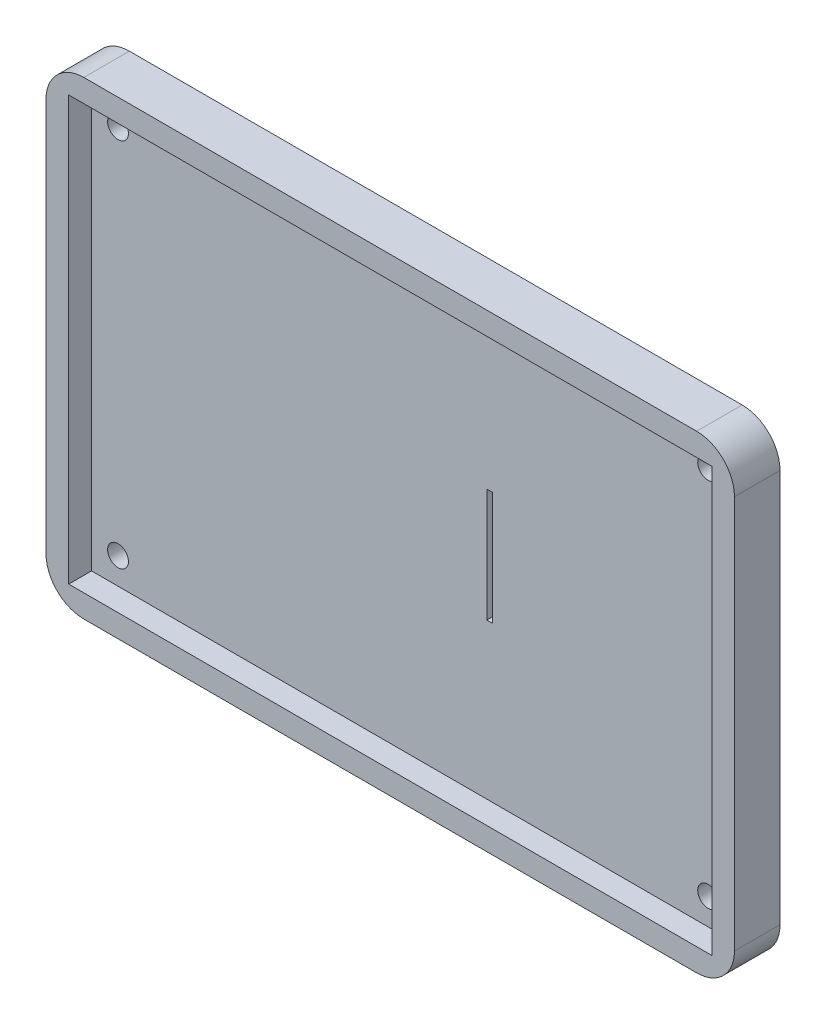
ISO-10303-21;
HEADER;
FILE_DESCRIPTION(('STEP AP214'),'2;1');
FILE_NAME('part.step','',(''),(''),'','','');
FILE_SCHEMA(('AUTOMOTIVE_DESIGN { 1 0 10303 214 1 1 1 1 }'));
ENDSEC;
DATA;
#1=APPLICATION_CONTEXT('core data for automotive mechanical design processes');
#2=APPLICATION_PROTOCOL_DEFINITION('international standard','automotive_design',2000,#1);
#3=PRODUCT_CONTEXT('',#1,'mechanical');
#4=PRODUCT('Part','Part','',(#3));
#5=PRODUCT_RELATED_PRODUCT_CATEGORY('part','',(#4));
#6=PRODUCT_DEFINITION_FORMATION('','',#4);
#7=PRODUCT_DEFINITION_CONTEXT('part definition',#1,'design');
#8=PRODUCT_DEFINITION('design','',#6,#7);
#9=PRODUCT_DEFINITION_SHAPE('','',#8);
#10=(LENGTH_UNIT() NAMED_UNIT(*) SI_UNIT(.MILLI.,.METRE.));
#11=(NAMED_UNIT(*) PLANE_ANGLE_UNIT() SI_UNIT($,.RADIAN.));
#12=(NAMED_UNIT(*) SI_UNIT($,.STERADIAN.) SOLID_ANGLE_UNIT());
#13=UNCERTAINTY_MEASURE_WITH_UNIT(LENGTH_MEASURE(1.E-05),#10,'distance_accuracy_value','');
#14=(GEOMETRIC_REPRESENTATION_CONTEXT(3) GLOBAL_UNCERTAINTY_ASSIGNED_CONTEXT((#13)) GLOBAL_UNIT_ASSIGNED_CONTEXT((#10,
#11,#12)) REPRESENTATION_CONTEXT('',''));
#15=CARTESIAN_POINT('',(0.,0.,0.));
#16=DIRECTION('',(0.,0.,1.));
#17=DIRECTION('',(1.,0.,0.));
#18=AXIS2_PLACEMENT_3D('',#15,#16,#17);
#19=CARTESIAN_POINT('',(0.,0.,3.));
#20=DIRECTION('',(0.,0.,-1.));
#21=DIRECTION('',(-1.,0.,0.));
#22=AXIS2_PLACEMENT_3D('',#19,#20,#21);
#23=PLANE('',#22);
#24=DIRECTION('',(-1.,0.,0.));
#25=VECTOR('',#24,1.);
#26=CARTESIAN_POINT('',(10.5,7.5,3.));
#27=LINE('',#26,#25);
#28=CARTESIAN_POINT('',(10.5,7.5,3.));
#29=VERTEX_POINT('',#28);
#30=CARTESIAN_POINT('',(9.74999999999999,7.5,3.));
#31=VERTEX_POINT('',#30);
#32=EDGE_CURVE('E479',#29,#31,#27,.T.);
#33=ORIENTED_EDGE('',*,*,#32,.F.);
#34=DIRECTION('',(0.,1.,0.));
#35=VECTOR('',#34,1.);
#36=CARTESIAN_POINT('',(10.5,7.5,3.));
#37=LINE('',#36,#35);
#38=CARTESIAN_POINT('',(10.5,-7.5,3.));
#39=VERTEX_POINT('',#38);
#40=EDGE_CURVE('E176',#39,#29,#37,.T.);
#41=ORIENTED_EDGE('',*,*,#40,.F.);
#42=DIRECTION('',(1.,0.,0.));
#43=VECTOR('',#42,1.);
#44=CARTESIAN_POINT('',(10.5,-7.5,3.));
#45=LINE('',#44,#43);
#46=CARTESIAN_POINT('',(9.74999999999999,-7.5,3.));
#47=VERTEX_POINT('',#46);
#48=EDGE_CURVE('E173',#47,#39,#45,.T.);
#49=ORIENTED_EDGE('',*,*,#48,.F.);
#50=DIRECTION('',(0.,-1.,0.));
#51=VECTOR('',#50,1.);
#52=CARTESIAN_POINT('',(9.74999999999999,7.5,3.));
#53=LINE('',#52,#51);
#54=EDGE_CURVE('E151',#31,#47,#53,.T.);
#55=ORIENTED_EDGE('',*,*,#54,.F.);
#56=EDGE_LOOP('',(#33,#41,#49,#55));
#57=FACE_BOUND('',#56,.T.);
#58=DIRECTION('',(1.,0.,0.));
#59=VECTOR('',#58,1.);
#60=CARTESIAN_POINT('',(-42.5,-28.,3.));
#61=LINE('',#60,#59);
#62=CARTESIAN_POINT('',(-42.5,-28.,3.));
#63=VERTEX_POINT('',#62);
#64=CARTESIAN_POINT('',(42.5,-28.,3.));
#65=VERTEX_POINT('',#64);
#66=EDGE_CURVE('E180',#63,#65,#61,.T.);
#67=ORIENTED_EDGE('',*,*,#66,.T.);
#68=DIRECTION('',(0.,1.,0.));
#69=VECTOR('',#68,1.);
#70=CARTESIAN_POINT('',(42.5,-28.,3.));
#71=LINE('',#70,#69);
#72=CARTESIAN_POINT('',(42.5,28.,3.));
#73=VERTEX_POINT('',#72);
#74=EDGE_CURVE('E175',#65,#73,#71,.T.);
#75=ORIENTED_EDGE('',*,*,#74,.T.);
#76=DIRECTION('',(-1.,0.,0.));
#77=VECTOR('',#76,1.);
#78=CARTESIAN_POINT('',(-42.5,28.,3.));
#79=LINE('',#78,#77);
#80=CARTESIAN_POINT('',(-42.5,28.,3.));
#81=VERTEX_POINT('',#80);
#82=EDGE_CURVE('E190',#73,#81,#79,.T.);
#83=ORIENTED_EDGE('',*,*,#82,.T.);
#84=DIRECTION('',(0.,-1.,0.));
#85=VECTOR('',#84,1.);
#86=CARTESIAN_POINT('',(-42.5,-28.,3.));
#87=LINE('',#86,#85);
#88=EDGE_CURVE('E193',#81,#63,#87,.T.);
#89=ORIENTED_EDGE('',*,*,#88,.T.);
#90=EDGE_LOOP('',(#67,#75,#83,#89));
#91=FACE_BOUND('',#90,.T.);
#92=CARTESIAN_POINT('',(-39.,24.5,3.));
#93=DIRECTION('',(0.,0.,1.));
#94=DIRECTION('',(1.,0.,0.));
#95=AXIS2_PLACEMENT_3D('',#92,#93,#94);
#96=CIRCLE('',#95,1.375);
#97=CARTESIAN_POINT('',(-37.625,24.5,3.));
#98=VERTEX_POINT('',#97);
#99=EDGE_CURVE('E237',#98,#98,#96,.T.);
#100=ORIENTED_EDGE('',*,*,#99,.F.);
#101=EDGE_LOOP('',(#100));
#102=FACE_BOUND('',#101,.T.);
#103=CARTESIAN_POINT('',(39.,-24.5,3.));
#104=DIRECTION('',(0.,0.,1.));
#105=DIRECTION('',(1.,0.,0.));
#106=AXIS2_PLACEMENT_3D('',#103,#104,#105);
#107=CIRCLE('',#106,1.375);
#108=CARTESIAN_POINT('',(40.375,-24.5,3.));
#109=VERTEX_POINT('',#108);
#110=EDGE_CURVE('E231',#109,#109,#107,.T.);
#111=ORIENTED_EDGE('',*,*,#110,.F.);
#112=EDGE_LOOP('',(#111));
#113=FACE_BOUND('',#112,.T.);
#114=CARTESIAN_POINT('',(39.,24.5,3.));
#115=DIRECTION('',(0.,0.,1.));
#116=DIRECTION('',(-1.,0.,0.));
#117=AXIS2_PLACEMENT_3D('',#114,#115,#116);
#118=CIRCLE('',#117,1.375);
#119=CARTESIAN_POINT('',(37.625,24.5,3.));
#120=VERTEX_POINT('',#119);
#121=EDGE_CURVE('E225',#120,#120,#118,.T.);
#122=ORIENTED_EDGE('',*,*,#121,.F.);
#123=EDGE_LOOP('',(#122));
#124=FACE_BOUND('',#123,.T.);
#125=CARTESIAN_POINT('',(-39.,-24.5,3.));
#126=DIRECTION('',(0.,0.,1.));
#127=DIRECTION('',(-1.,0.,0.));
#128=AXIS2_PLACEMENT_3D('',#125,#126,#127);
#129=CIRCLE('',#128,1.375);
#130=CARTESIAN_POINT('',(-40.375,-24.5,3.));
#131=VERTEX_POINT('',#130);
#132=EDGE_CURVE('E219',#131,#131,#129,.T.);
#133=ORIENTED_EDGE('',*,*,#132,.F.);
#134=EDGE_LOOP('',(#133));
#135=FACE_BOUND('',#134,.T.);
#136=ADVANCED_FACE('F33',(#57,#91,#102,#113,#124,#135),#23,.F.);
#137=CARTESIAN_POINT('',(0.,0.,0.));
#138=DIRECTION('',(0.,0.,-1.));
#139=DIRECTION('',(-1.,0.,0.));
#140=AXIS2_PLACEMENT_3D('',#137,#138,#139);
#141=PLANE('',#140);
#142=DIRECTION('',(0.,-1.,0.));
#143=VECTOR('',#142,1.);
#144=CARTESIAN_POINT('',(10.5,7.5,0.));
#145=LINE('',#144,#143);
#146=CARTESIAN_POINT('',(10.5,7.5,0.));
#147=VERTEX_POINT('',#146);
#148=CARTESIAN_POINT('',(10.5,-7.5,0.));
#149=VERTEX_POINT('',#148);
#150=EDGE_CURVE('E56',#147,#149,#145,.T.);
#151=ORIENTED_EDGE('',*,*,#150,.F.);
#152=DIRECTION('',(1.,0.,0.));
#153=VECTOR('',#152,1.);
#154=CARTESIAN_POINT('',(10.5,7.5,0.));
#155=LINE('',#154,#153);
#156=CARTESIAN_POINT('',(9.74999999999999,7.5,0.));
#157=VERTEX_POINT('',#156);
#158=EDGE_CURVE('E164',#157,#147,#155,.T.);
#159=ORIENTED_EDGE('',*,*,#158,.F.);
#160=DIRECTION('',(0.,1.,0.));
#161=VECTOR('',#160,1.);
#162=CARTESIAN_POINT('',(9.74999999999999,7.5,0.));
#163=LINE('',#162,#161);
#164=CARTESIAN_POINT('',(9.74999999999999,-7.5,0.));
#165=VERTEX_POINT('',#164);
#166=EDGE_CURVE('E148',#165,#157,#163,.T.);
#167=ORIENTED_EDGE('',*,*,#166,.F.);
#168=DIRECTION('',(-1.,0.,0.));
#169=VECTOR('',#168,1.);
#170=CARTESIAN_POINT('',(10.5,-7.5,0.));
#171=LINE('',#170,#169);
#172=EDGE_CURVE('E157',#149,#165,#171,.T.);
#173=ORIENTED_EDGE('',*,*,#172,.F.);
#174=EDGE_LOOP('',(#151,#159,#167,#173));
#175=FACE_BOUND('',#174,.T.);
#176=CARTESIAN_POINT('',(39.,24.5,0.));
#177=DIRECTION('',(0.,0.,1.));
#178=DIRECTION('',(-1.,0.,0.));
#179=AXIS2_PLACEMENT_3D('',#176,#177,#178);
#180=CIRCLE('',#179,1.375);
#181=CARTESIAN_POINT('',(37.625,24.5,0.));
#182=VERTEX_POINT('',#181);
#183=EDGE_CURVE('E222',#182,#182,#180,.T.);
#184=ORIENTED_EDGE('',*,*,#183,.T.);
#185=EDGE_LOOP('',(#184));
#186=FACE_BOUND('',#185,.T.);
#187=CARTESIAN_POINT('',(-39.,24.5,0.));
#188=DIRECTION('',(0.,0.,1.));
#189=DIRECTION('',(1.,0.,0.));
#190=AXIS2_PLACEMENT_3D('',#187,#188,#189);
#191=CIRCLE('',#190,1.375);
#192=CARTESIAN_POINT('',(-37.625,24.5,0.));
#193=VERTEX_POINT('',#192);
#194=EDGE_CURVE('E234',#193,#193,#191,.T.);
#195=ORIENTED_EDGE('',*,*,#194,.T.);
#196=EDGE_LOOP('',(#195));
#197=FACE_BOUND('',#196,.T.);
#198=DIRECTION('',(1.,0.,0.));
#199=VECTOR('',#198,1.);
#200=CARTESIAN_POINT('',(-45.5,-31.,0.));
#201=LINE('',#200,#199);
#202=CARTESIAN_POINT('',(-40.5,-31.,0.));
#203=VERTEX_POINT('',#202);
#204=CARTESIAN_POINT('',(40.5,-31.,0.));
#205=VERTEX_POINT('',#204);
#206=EDGE_CURVE('E251',#203,#205,#201,.T.);
#207=ORIENTED_EDGE('',*,*,#206,.F.);
#208=CARTESIAN_POINT('',(-40.5,-26.,0.));
#209=DIRECTION('',(0.,0.,-1.));
#210=DIRECTION('',(-1.,0.,0.));
#211=AXIS2_PLACEMENT_3D('',#208,#209,#210);
#212=CIRCLE('',#211,5.);
#213=CARTESIAN_POINT('',(-45.5,-26.,0.));
#214=VERTEX_POINT('',#213);
#215=EDGE_CURVE('E265',#203,#214,#212,.T.);
#216=ORIENTED_EDGE('',*,*,#215,.T.);
#217=DIRECTION('',(0.,-1.,0.));
#218=VECTOR('',#217,1.);
#219=CARTESIAN_POINT('',(-45.5,-31.,0.));
#220=LINE('',#219,#218);
#221=CARTESIAN_POINT('',(-45.5,26.,0.));
#222=VERTEX_POINT('',#221);
#223=EDGE_CURVE('E248',#222,#214,#220,.T.);
#224=ORIENTED_EDGE('',*,*,#223,.F.);
#225=CARTESIAN_POINT('',(-40.5,26.,0.));
#226=DIRECTION('',(0.,0.,-1.));
#227=DIRECTION('',(-1.,0.,0.));
#228=AXIS2_PLACEMENT_3D('',#225,#226,#227);
#229=CIRCLE('',#228,5.);
#230=CARTESIAN_POINT('',(-40.5,31.,0.));
#231=VERTEX_POINT('',#230);
#232=EDGE_CURVE('E259',#222,#231,#229,.T.);
#233=ORIENTED_EDGE('',*,*,#232,.T.);
#234=DIRECTION('',(-1.,0.,0.));
#235=VECTOR('',#234,1.);
#236=CARTESIAN_POINT('',(-45.5,31.,0.));
#237=LINE('',#236,#235);
#238=CARTESIAN_POINT('',(40.5,31.,0.));
#239=VERTEX_POINT('',#238);
#240=EDGE_CURVE('E245',#239,#231,#237,.T.);
#241=ORIENTED_EDGE('',*,*,#240,.F.);
#242=CARTESIAN_POINT('',(40.5,26.,0.));
#243=DIRECTION('',(0.,0.,-1.));
#244=DIRECTION('',(-1.,0.,0.));
#245=AXIS2_PLACEMENT_3D('',#242,#243,#244);
#246=CIRCLE('',#245,5.);
#247=CARTESIAN_POINT('',(45.5,26.,0.));
#248=VERTEX_POINT('',#247);
#249=EDGE_CURVE('E263',#239,#248,#246,.T.);
#250=ORIENTED_EDGE('',*,*,#249,.T.);
#251=DIRECTION('',(0.,1.,0.));
#252=VECTOR('',#251,1.);
#253=CARTESIAN_POINT('',(45.5,-31.,0.));
#254=LINE('',#253,#252);
#255=CARTESIAN_POINT('',(45.5,-26.,0.));
#256=VERTEX_POINT('',#255);
#257=EDGE_CURVE('E240',#256,#248,#254,.T.);
#258=ORIENTED_EDGE('',*,*,#257,.F.);
#259=CARTESIAN_POINT('',(40.5,-26.,0.));
#260=DIRECTION('',(0.,0.,-1.));
#261=DIRECTION('',(-1.,0.,0.));
#262=AXIS2_PLACEMENT_3D('',#259,#260,#261);
#263=CIRCLE('',#262,5.);
#264=EDGE_CURVE('E261',#256,#205,#263,.T.);
#265=ORIENTED_EDGE('',*,*,#264,.T.);
#266=EDGE_LOOP('',(#207,#216,#224,#233,#241,#250,#258,#265));
#267=FACE_BOUND('',#266,.T.);
#268=CARTESIAN_POINT('',(39.,-24.5,0.));
#269=DIRECTION('',(0.,0.,1.));
#270=DIRECTION('',(1.,0.,0.));
#271=AXIS2_PLACEMENT_3D('',#268,#269,#270);
#272=CIRCLE('',#271,1.375);
#273=CARTESIAN_POINT('',(40.375,-24.5,0.));
#274=VERTEX_POINT('',#273);
#275=EDGE_CURVE('E228',#274,#274,#272,.T.);
#276=ORIENTED_EDGE('',*,*,#275,.T.);
#277=EDGE_LOOP('',(#276));
#278=FACE_BOUND('',#277,.T.);
#279=CARTESIAN_POINT('',(-39.,-24.5,0.));
#280=DIRECTION('',(0.,0.,1.));
#281=DIRECTION('',(-1.,0.,0.));
#282=AXIS2_PLACEMENT_3D('',#279,#280,#281);
#283=CIRCLE('',#282,1.375);
#284=CARTESIAN_POINT('',(-40.375,-24.5,0.));
#285=VERTEX_POINT('',#284);
#286=EDGE_CURVE('E218',#285,#285,#283,.T.);
#287=ORIENTED_EDGE('',*,*,#286,.T.);
#288=EDGE_LOOP('',(#287));
#289=FACE_BOUND('',#288,.T.);
#290=ADVANCED_FACE('F161',(#175,#186,#197,#267,#278,#289),#141,.T.);
#291=CARTESIAN_POINT('',(45.5,-31.,3.));
#292=DIRECTION('',(-1.,0.,0.));
#293=DIRECTION('',(0.,0.,1.));
#294=AXIS2_PLACEMENT_3D('',#291,#292,#293);
#295=PLANE('',#294);
#296=ORIENTED_EDGE('',*,*,#257,.T.);
#297=DIRECTION('',(0.,0.,-1.));
#298=VECTOR('',#297,1.);
#299=CARTESIAN_POINT('',(45.5,26.,3.));
#300=LINE('',#299,#298);
#301=CARTESIAN_POINT('',(45.5,26.,6.02));
#302=VERTEX_POINT('',#301);
#303=EDGE_CURVE('E11',#248,#302,#300,.F.);
#304=ORIENTED_EDGE('',*,*,#303,.T.);
#305=DIRECTION('',(0.,1.,0.));
#306=VECTOR('',#305,1.);
#307=CARTESIAN_POINT('',(45.5,-31.,6.02));
#308=LINE('',#307,#306);
#309=CARTESIAN_POINT('',(45.5,-26.,6.02));
#310=VERTEX_POINT('',#309);
#311=EDGE_CURVE('E206',#310,#302,#308,.T.);
#312=ORIENTED_EDGE('',*,*,#311,.F.);
#313=DIRECTION('',(0.,0.,-1.));
#314=VECTOR('',#313,1.);
#315=CARTESIAN_POINT('',(45.5,-26.,3.));
#316=LINE('',#315,#314);
#317=EDGE_CURVE('E41',#310,#256,#316,.T.);
#318=ORIENTED_EDGE('',*,*,#317,.T.);
#319=EDGE_LOOP('',(#296,#304,#312,#318));
#320=FACE_BOUND('',#319,.T.);
#321=ADVANCED_FACE('F289',(#320),#295,.F.);
#322=CARTESIAN_POINT('',(-45.5,31.,3.));
#323=DIRECTION('',(0.,-1.,0.));
#324=DIRECTION('',(0.,0.,-1.));
#325=AXIS2_PLACEMENT_3D('',#322,#323,#324);
#326=PLANE('',#325);
#327=DIRECTION('',(-1.,0.,0.));
#328=VECTOR('',#327,1.);
#329=CARTESIAN_POINT('',(-45.5,31.,6.02));
#330=LINE('',#329,#328);
#331=CARTESIAN_POINT('',(40.5,31.,6.02));
#332=VERTEX_POINT('',#331);
#333=CARTESIAN_POINT('',(-40.5,31.,6.02));
#334=VERTEX_POINT('',#333);
#335=EDGE_CURVE('E209',#332,#334,#330,.T.);
#336=ORIENTED_EDGE('',*,*,#335,.F.);
#337=DIRECTION('',(0.,0.,-1.));
#338=VECTOR('',#337,1.);
#339=CARTESIAN_POINT('',(40.5,31.,3.));
#340=LINE('',#339,#338);
#341=EDGE_CURVE('E282',#332,#239,#340,.T.);
#342=ORIENTED_EDGE('',*,*,#341,.T.);
#343=ORIENTED_EDGE('',*,*,#240,.T.);
#344=DIRECTION('',(0.,0.,-1.));
#345=VECTOR('',#344,1.);
#346=CARTESIAN_POINT('',(-40.5,31.,3.));
#347=LINE('',#346,#345);
#348=EDGE_CURVE('E280',#231,#334,#347,.F.);
#349=ORIENTED_EDGE('',*,*,#348,.T.);
#350=EDGE_LOOP('',(#336,#342,#343,#349));
#351=FACE_BOUND('',#350,.T.);
#352=ADVANCED_FACE('F303',(#351),#326,.F.);
#353=CARTESIAN_POINT('',(-45.5,-31.,3.));
#354=DIRECTION('',(1.,0.,0.));
#355=DIRECTION('',(0.,0.,-1.));
#356=AXIS2_PLACEMENT_3D('',#353,#354,#355);
#357=PLANE('',#356);
#358=ORIENTED_EDGE('',*,*,#223,.T.);
#359=DIRECTION('',(0.,0.,-1.));
#360=VECTOR('',#359,1.);
#361=CARTESIAN_POINT('',(-45.5,-26.,3.));
#362=LINE('',#361,#360);
#363=CARTESIAN_POINT('',(-45.5,-26.,6.02));
#364=VERTEX_POINT('',#363);
#365=EDGE_CURVE('E270',#214,#364,#362,.F.);
#366=ORIENTED_EDGE('',*,*,#365,.T.);
#367=DIRECTION('',(0.,-1.,0.));
#368=VECTOR('',#367,1.);
#369=CARTESIAN_POINT('',(-45.5,-31.,6.02));
#370=LINE('',#369,#368);
#371=CARTESIAN_POINT('',(-45.5,26.,6.02));
#372=VERTEX_POINT('',#371);
#373=EDGE_CURVE('E212',#372,#364,#370,.T.);
#374=ORIENTED_EDGE('',*,*,#373,.F.);
#375=DIRECTION('',(0.,0.,-1.));
#376=VECTOR('',#375,1.);
#377=CARTESIAN_POINT('',(-45.5,26.,3.));
#378=LINE('',#377,#376);
#379=EDGE_CURVE('E267',#372,#222,#378,.T.);
#380=ORIENTED_EDGE('',*,*,#379,.T.);
#381=EDGE_LOOP('',(#358,#366,#374,#380));
#382=FACE_BOUND('',#381,.T.);
#383=ADVANCED_FACE('F314',(#382),#357,.F.);
#384=CARTESIAN_POINT('',(-45.5,-31.,3.));
#385=DIRECTION('',(0.,1.,0.));
#386=DIRECTION('',(0.,0.,1.));
#387=AXIS2_PLACEMENT_3D('',#384,#385,#386);
#388=PLANE('',#387);
#389=DIRECTION('',(1.,0.,0.));
#390=VECTOR('',#389,1.);
#391=CARTESIAN_POINT('',(-45.5,-31.,6.02));
#392=LINE('',#391,#390);
#393=CARTESIAN_POINT('',(-40.5,-31.,6.02));
#394=VERTEX_POINT('',#393);
#395=CARTESIAN_POINT('',(40.5,-31.,6.02));
#396=VERTEX_POINT('',#395);
#397=EDGE_CURVE('E215',#394,#396,#392,.T.);
#398=ORIENTED_EDGE('',*,*,#397,.F.);
#399=DIRECTION('',(0.,0.,-1.));
#400=VECTOR('',#399,1.);
#401=CARTESIAN_POINT('',(-40.5,-31.,3.));
#402=LINE('',#401,#400);
#403=EDGE_CURVE('E256',#394,#203,#402,.T.);
#404=ORIENTED_EDGE('',*,*,#403,.T.);
#405=ORIENTED_EDGE('',*,*,#206,.T.);
#406=DIRECTION('',(0.,0.,-1.));
#407=VECTOR('',#406,1.);
#408=CARTESIAN_POINT('',(40.5,-31.,3.));
#409=LINE('',#408,#407);
#410=EDGE_CURVE('E254',#205,#396,#409,.F.);
#411=ORIENTED_EDGE('',*,*,#410,.T.);
#412=EDGE_LOOP('',(#398,#404,#405,#411));
#413=FACE_BOUND('',#412,.T.);
#414=ADVANCED_FACE('F322',(#413),#388,.F.);
#415=CARTESIAN_POINT('',(-39.,24.5,3.));
#416=DIRECTION('',(0.,0.,-1.));
#417=DIRECTION('',(-1.,0.,0.));
#418=AXIS2_PLACEMENT_3D('',#415,#416,#417);
#419=CYLINDRICAL_SURFACE('',#418,1.375);
#420=ORIENTED_EDGE('',*,*,#99,.T.);
#421=EDGE_LOOP('',(#420));
#422=FACE_BOUND('',#421,.T.);
#423=ORIENTED_EDGE('',*,*,#194,.F.);
#424=EDGE_LOOP('',(#423));
#425=FACE_BOUND('',#424,.T.);
#426=ADVANCED_FACE('F343',(#422,#425),#419,.F.);
#427=CARTESIAN_POINT('',(39.,-24.5,3.));
#428=DIRECTION('',(0.,0.,-1.));
#429=DIRECTION('',(-1.,0.,0.));
#430=AXIS2_PLACEMENT_3D('',#427,#428,#429);
#431=CYLINDRICAL_SURFACE('',#430,1.375);
#432=ORIENTED_EDGE('',*,*,#110,.T.);
#433=EDGE_LOOP('',(#432));
#434=FACE_BOUND('',#433,.T.);
#435=ORIENTED_EDGE('',*,*,#275,.F.);
#436=EDGE_LOOP('',(#435));
#437=FACE_BOUND('',#436,.T.);
#438=ADVANCED_FACE('F387',(#434,#437),#431,.F.);
#439=CARTESIAN_POINT('',(39.,24.5,3.));
#440=DIRECTION('',(0.,0.,-1.));
#441=DIRECTION('',(-1.,0.,0.));
#442=AXIS2_PLACEMENT_3D('',#439,#440,#441);
#443=CYLINDRICAL_SURFACE('',#442,1.375);
#444=ORIENTED_EDGE('',*,*,#121,.T.);
#445=EDGE_LOOP('',(#444));
#446=FACE_BOUND('',#445,.T.);
#447=ORIENTED_EDGE('',*,*,#183,.F.);
#448=EDGE_LOOP('',(#447));
#449=FACE_BOUND('',#448,.T.);
#450=ADVANCED_FACE('F384',(#446,#449),#443,.F.);
#451=CARTESIAN_POINT('',(-39.,-24.5,3.));
#452=DIRECTION('',(0.,0.,-1.));
#453=DIRECTION('',(-1.,0.,0.));
#454=AXIS2_PLACEMENT_3D('',#451,#452,#453);
#455=CYLINDRICAL_SURFACE('',#454,1.375);
#456=ORIENTED_EDGE('',*,*,#132,.T.);
#457=EDGE_LOOP('',(#456));
#458=FACE_BOUND('',#457,.T.);
#459=ORIENTED_EDGE('',*,*,#286,.F.);
#460=EDGE_LOOP('',(#459));
#461=FACE_BOUND('',#460,.T.);
#462=ADVANCED_FACE('F381',(#458,#461),#455,.F.);
#463=CARTESIAN_POINT('',(0.,0.,6.02));
#464=DIRECTION('',(0.,0.,-1.));
#465=DIRECTION('',(-1.,0.,0.));
#466=AXIS2_PLACEMENT_3D('',#463,#464,#465);
#467=PLANE('',#466);
#468=ORIENTED_EDGE('',*,*,#373,.T.);
#469=CARTESIAN_POINT('',(-40.5,-26.,6.02));
#470=DIRECTION('',(0.,0.,-1.));
#471=DIRECTION('',(-1.,0.,0.));
#472=AXIS2_PLACEMENT_3D('',#469,#470,#471);
#473=CIRCLE('',#472,5.);
#474=EDGE_CURVE('E278',#364,#394,#473,.F.);
#475=ORIENTED_EDGE('',*,*,#474,.T.);
#476=ORIENTED_EDGE('',*,*,#397,.T.);
#477=CARTESIAN_POINT('',(40.5,-26.,6.02));
#478=DIRECTION('',(0.,0.,-1.));
#479=DIRECTION('',(-1.,0.,0.));
#480=AXIS2_PLACEMENT_3D('',#477,#478,#479);
#481=CIRCLE('',#480,5.);
#482=EDGE_CURVE('E274',#396,#310,#481,.F.);
#483=ORIENTED_EDGE('',*,*,#482,.T.);
#484=ORIENTED_EDGE('',*,*,#311,.T.);
#485=CARTESIAN_POINT('',(40.5,26.,6.02));
#486=DIRECTION('',(0.,0.,-1.));
#487=DIRECTION('',(-1.,0.,0.));
#488=AXIS2_PLACEMENT_3D('',#485,#486,#487);
#489=CIRCLE('',#488,5.);
#490=EDGE_CURVE('E276',#302,#332,#489,.F.);
#491=ORIENTED_EDGE('',*,*,#490,.T.);
#492=ORIENTED_EDGE('',*,*,#335,.T.);
#493=CARTESIAN_POINT('',(-40.5,26.,6.02));
#494=DIRECTION('',(0.,0.,-1.));
#495=DIRECTION('',(-1.,0.,0.));
#496=AXIS2_PLACEMENT_3D('',#493,#494,#495);
#497=CIRCLE('',#496,5.);
#498=EDGE_CURVE('E272',#334,#372,#497,.F.);
#499=ORIENTED_EDGE('',*,*,#498,.T.);
#500=EDGE_LOOP('',(#468,#475,#476,#483,#484,#491,#492,#499));
#501=FACE_BOUND('',#500,.T.);
#502=DIRECTION('',(0.,1.,0.));
#503=VECTOR('',#502,1.);
#504=CARTESIAN_POINT('',(42.5,-28.,6.02));
#505=LINE('',#504,#503);
#506=CARTESIAN_POINT('',(42.5,-28.,6.02));
#507=VERTEX_POINT('',#506);
#508=CARTESIAN_POINT('',(42.5,28.,6.02));
#509=VERTEX_POINT('',#508);
#510=EDGE_CURVE('E177',#507,#509,#505,.T.);
#511=ORIENTED_EDGE('',*,*,#510,.F.);
#512=DIRECTION('',(1.,0.,0.));
#513=VECTOR('',#512,1.);
#514=CARTESIAN_POINT('',(-42.5,-28.,6.02));
#515=LINE('',#514,#513);
#516=CARTESIAN_POINT('',(-42.5,-28.,6.02));
#517=VERTEX_POINT('',#516);
#518=EDGE_CURVE('E185',#517,#507,#515,.T.);
#519=ORIENTED_EDGE('',*,*,#518,.F.);
#520=DIRECTION('',(0.,-1.,0.));
#521=VECTOR('',#520,1.);
#522=CARTESIAN_POINT('',(-42.5,-28.,6.02));
#523=LINE('',#522,#521);
#524=CARTESIAN_POINT('',(-42.5,28.,6.02));
#525=VERTEX_POINT('',#524);
#526=EDGE_CURVE('E182',#525,#517,#523,.T.);
#527=ORIENTED_EDGE('',*,*,#526,.F.);
#528=DIRECTION('',(-1.,0.,0.));
#529=VECTOR('',#528,1.);
#530=CARTESIAN_POINT('',(-42.5,28.,6.02));
#531=LINE('',#530,#529);
#532=EDGE_CURVE('E179',#509,#525,#531,.T.);
#533=ORIENTED_EDGE('',*,*,#532,.F.);
#534=EDGE_LOOP('',(#511,#519,#527,#533));
#535=FACE_BOUND('',#534,.T.);
#536=ADVANCED_FACE('F307',(#501,#535),#467,.F.);
#537=CARTESIAN_POINT('',(42.5,-28.,6.02));
#538=DIRECTION('',(-1.,0.,0.));
#539=DIRECTION('',(0.,0.,1.));
#540=AXIS2_PLACEMENT_3D('',#537,#538,#539);
#541=PLANE('',#540);
#542=ORIENTED_EDGE('',*,*,#74,.F.);
#543=DIRECTION('',(0.,0.,-1.));
#544=VECTOR('',#543,1.);
#545=CARTESIAN_POINT('',(42.5,-28.,6.02));
#546=LINE('',#545,#544);
#547=EDGE_CURVE('E187',#507,#65,#546,.T.);
#548=ORIENTED_EDGE('',*,*,#547,.F.);
#549=ORIENTED_EDGE('',*,*,#510,.T.);
#550=DIRECTION('',(0.,0.,-1.));
#551=VECTOR('',#550,1.);
#552=CARTESIAN_POINT('',(42.5,28.,6.02));
#553=LINE('',#552,#551);
#554=EDGE_CURVE('E203',#509,#73,#553,.T.);
#555=ORIENTED_EDGE('',*,*,#554,.T.);
#556=EDGE_LOOP('',(#542,#548,#549,#555));
#557=FACE_BOUND('',#556,.T.);
#558=ADVANCED_FACE('F374',(#557),#541,.T.);
#559=CARTESIAN_POINT('',(-42.5,28.,6.02));
#560=DIRECTION('',(0.,-1.,0.));
#561=DIRECTION('',(1.,0.,0.));
#562=AXIS2_PLACEMENT_3D('',#559,#560,#561);
#563=PLANE('',#562);
#564=ORIENTED_EDGE('',*,*,#82,.F.);
#565=ORIENTED_EDGE('',*,*,#554,.F.);
#566=ORIENTED_EDGE('',*,*,#532,.T.);
#567=DIRECTION('',(0.,0.,-1.));
#568=VECTOR('',#567,1.);
#569=CARTESIAN_POINT('',(-42.5,28.,6.02));
#570=LINE('',#569,#568);
#571=EDGE_CURVE('E201',#525,#81,#570,.T.);
#572=ORIENTED_EDGE('',*,*,#571,.T.);
#573=EDGE_LOOP('',(#564,#565,#566,#572));
#574=FACE_BOUND('',#573,.T.);
#575=ADVANCED_FACE('F365',(#574),#563,.T.);
#576=CARTESIAN_POINT('',(-42.5,-28.,6.02));
#577=DIRECTION('',(1.,0.,0.));
#578=DIRECTION('',(0.,0.,-1.));
#579=AXIS2_PLACEMENT_3D('',#576,#577,#578);
#580=PLANE('',#579);
#581=ORIENTED_EDGE('',*,*,#88,.F.);
#582=ORIENTED_EDGE('',*,*,#571,.F.);
#583=ORIENTED_EDGE('',*,*,#526,.T.);
#584=DIRECTION('',(0.,0.,-1.));
#585=VECTOR('',#584,1.);
#586=CARTESIAN_POINT('',(-42.5,-28.,6.02));
#587=LINE('',#586,#585);
#588=EDGE_CURVE('E199',#517,#63,#587,.T.);
#589=ORIENTED_EDGE('',*,*,#588,.T.);
#590=EDGE_LOOP('',(#581,#582,#583,#589));
#591=FACE_BOUND('',#590,.T.);
#592=ADVANCED_FACE('F359',(#591),#580,.T.);
#593=CARTESIAN_POINT('',(-42.5,-28.,6.02));
#594=DIRECTION('',(0.,1.,0.));
#595=DIRECTION('',(-1.,0.,0.));
#596=AXIS2_PLACEMENT_3D('',#593,#594,#595);
#597=PLANE('',#596);
#598=ORIENTED_EDGE('',*,*,#66,.F.);
#599=ORIENTED_EDGE('',*,*,#588,.F.);
#600=ORIENTED_EDGE('',*,*,#518,.T.);
#601=ORIENTED_EDGE('',*,*,#547,.T.);
#602=EDGE_LOOP('',(#598,#599,#600,#601));
#603=FACE_BOUND('',#602,.T.);
#604=ADVANCED_FACE('F355',(#603),#597,.T.);
#605=CARTESIAN_POINT('',(-40.5,-26.,3.));
#606=DIRECTION('',(0.,0.,-1.));
#607=DIRECTION('',(-1.,0.,0.));
#608=AXIS2_PLACEMENT_3D('',#605,#606,#607);
#609=CYLINDRICAL_SURFACE('',#608,5.);
#610=ORIENTED_EDGE('',*,*,#474,.F.);
#611=ORIENTED_EDGE('',*,*,#365,.F.);
#612=ORIENTED_EDGE('',*,*,#215,.F.);
#613=ORIENTED_EDGE('',*,*,#403,.F.);
#614=EDGE_LOOP('',(#610,#611,#612,#613));
#615=FACE_BOUND('',#614,.T.);
#616=ADVANCED_FACE('F319',(#615),#609,.T.);
#617=CARTESIAN_POINT('',(40.5,26.,3.));
#618=DIRECTION('',(0.,0.,-1.));
#619=DIRECTION('',(-1.,0.,0.));
#620=AXIS2_PLACEMENT_3D('',#617,#618,#619);
#621=CYLINDRICAL_SURFACE('',#620,5.);
#622=ORIENTED_EDGE('',*,*,#490,.F.);
#623=ORIENTED_EDGE('',*,*,#303,.F.);
#624=ORIENTED_EDGE('',*,*,#249,.F.);
#625=ORIENTED_EDGE('',*,*,#341,.F.);
#626=EDGE_LOOP('',(#622,#623,#624,#625));
#627=FACE_BOUND('',#626,.T.);
#628=ADVANCED_FACE('F300',(#627),#621,.T.);
#629=CARTESIAN_POINT('',(40.5,-26.,3.));
#630=DIRECTION('',(0.,0.,-1.));
#631=DIRECTION('',(-1.,0.,0.));
#632=AXIS2_PLACEMENT_3D('',#629,#630,#631);
#633=CYLINDRICAL_SURFACE('',#632,5.);
#634=ORIENTED_EDGE('',*,*,#482,.F.);
#635=ORIENTED_EDGE('',*,*,#410,.F.);
#636=ORIENTED_EDGE('',*,*,#264,.F.);
#637=ORIENTED_EDGE('',*,*,#317,.F.);
#638=EDGE_LOOP('',(#634,#635,#636,#637));
#639=FACE_BOUND('',#638,.T.);
#640=ADVANCED_FACE('F324',(#639),#633,.T.);
#641=CARTESIAN_POINT('',(-40.5,26.,3.));
#642=DIRECTION('',(0.,0.,-1.));
#643=DIRECTION('',(-1.,0.,0.));
#644=AXIS2_PLACEMENT_3D('',#641,#642,#643);
#645=CYLINDRICAL_SURFACE('',#644,5.);
#646=ORIENTED_EDGE('',*,*,#498,.F.);
#647=ORIENTED_EDGE('',*,*,#348,.F.);
#648=ORIENTED_EDGE('',*,*,#232,.F.);
#649=ORIENTED_EDGE('',*,*,#379,.F.);
#650=EDGE_LOOP('',(#646,#647,#648,#649));
#651=FACE_BOUND('',#650,.T.);
#652=ADVANCED_FACE('F35',(#651),#645,.T.);
#653=CARTESIAN_POINT('',(10.5,7.5,18.0187382958756));
#654=DIRECTION('',(1.,0.,0.));
#655=DIRECTION('',(0.,0.,-1.));
#656=AXIS2_PLACEMENT_3D('',#653,#654,#655);
#657=PLANE('',#656);
#658=ORIENTED_EDGE('',*,*,#40,.T.);
#659=DIRECTION('',(0.,0.,-1.));
#660=VECTOR('',#659,1.);
#661=CARTESIAN_POINT('',(10.5,7.5,18.0187382958756));
#662=LINE('',#661,#660);
#663=EDGE_CURVE('E169',#29,#147,#662,.T.);
#664=ORIENTED_EDGE('',*,*,#663,.T.);
#665=ORIENTED_EDGE('',*,*,#150,.T.);
#666=DIRECTION('',(0.,0.,-1.));
#667=VECTOR('',#666,1.);
#668=CARTESIAN_POINT('',(10.5,-7.5,18.0187382958756));
#669=LINE('',#668,#667);
#670=EDGE_CURVE('E154',#39,#149,#669,.T.);
#671=ORIENTED_EDGE('',*,*,#670,.F.);
#672=EDGE_LOOP('',(#658,#664,#665,#671));
#673=FACE_BOUND('',#672,.T.);
#674=ADVANCED_FACE('F330',(#673),#657,.F.);
#675=CARTESIAN_POINT('',(10.5,7.5,18.0187382958756));
#676=DIRECTION('',(0.,1.,0.));
#677=DIRECTION('',(0.,0.,1.));
#678=AXIS2_PLACEMENT_3D('',#675,#676,#677);
#679=PLANE('',#678);
#680=ORIENTED_EDGE('',*,*,#32,.T.);
#681=DIRECTION('',(0.,0.,-1.));
#682=VECTOR('',#681,1.);
#683=CARTESIAN_POINT('',(9.74999999999999,7.5,18.0187382958756));
#684=LINE('',#683,#682);
#685=EDGE_CURVE('E153',#31,#157,#684,.T.);
#686=ORIENTED_EDGE('',*,*,#685,.T.);
#687=ORIENTED_EDGE('',*,*,#158,.T.);
#688=ORIENTED_EDGE('',*,*,#663,.F.);
#689=EDGE_LOOP('',(#680,#686,#687,#688));
#690=FACE_BOUND('',#689,.T.);
#691=ADVANCED_FACE('F450',(#690),#679,.F.);
#692=CARTESIAN_POINT('',(9.74999999999999,7.5,18.0187382958756));
#693=DIRECTION('',(-1.,0.,0.));
#694=DIRECTION('',(0.,0.,1.));
#695=AXIS2_PLACEMENT_3D('',#692,#693,#694);
#696=PLANE('',#695);
#697=ORIENTED_EDGE('',*,*,#54,.T.);
#698=DIRECTION('',(0.,0.,-1.));
#699=VECTOR('',#698,1.);
#700=CARTESIAN_POINT('',(9.74999999999999,-7.5,18.0187382958756));
#701=LINE('',#700,#699);
#702=EDGE_CURVE('E48',#47,#165,#701,.T.);
#703=ORIENTED_EDGE('',*,*,#702,.T.);
#704=ORIENTED_EDGE('',*,*,#166,.T.);
#705=ORIENTED_EDGE('',*,*,#685,.F.);
#706=EDGE_LOOP('',(#697,#703,#704,#705));
#707=FACE_BOUND('',#706,.T.);
#708=ADVANCED_FACE('F145',(#707),#696,.F.);
#709=CARTESIAN_POINT('',(10.5,-7.5,18.0187382958756));
#710=DIRECTION('',(0.,-1.,0.));
#711=DIRECTION('',(0.,0.,-1.));
#712=AXIS2_PLACEMENT_3D('',#709,#710,#711);
#713=PLANE('',#712);
#714=ORIENTED_EDGE('',*,*,#48,.T.);
#715=ORIENTED_EDGE('',*,*,#670,.T.);
#716=ORIENTED_EDGE('',*,*,#172,.T.);
#717=ORIENTED_EDGE('',*,*,#702,.F.);
#718=EDGE_LOOP('',(#714,#715,#716,#717));
#719=FACE_BOUND('',#718,.T.);
#720=ADVANCED_FACE('F158',(#719),#713,.F.);
#721=CLOSED_SHELL('',(#136,#290,#321,#352,#383,#414,#426,#438,#450,#462,#536,#558,#575,#592,
#604,#616,#628,#640,#652,#674,#691,#708,#720));
#722=MANIFOLD_SOLID_BREP('B2',#721);
#723=ADVANCED_BREP_SHAPE_REPRESENTATION('',(#18,#722),#14);
#724=SHAPE_DEFINITION_REPRESENTATION(#9,#723);
ENDSEC;
END-ISO-10303-21;
